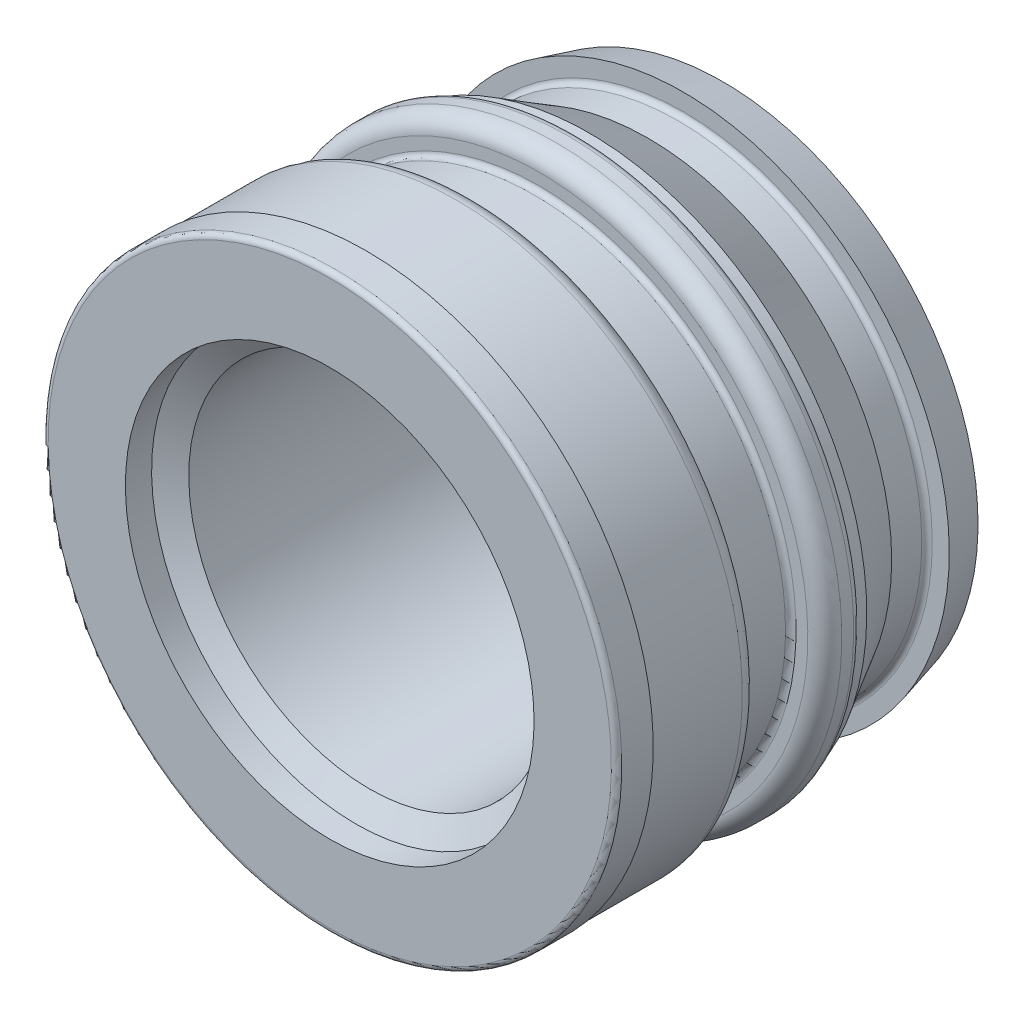
ISO-10303-21;
HEADER;
FILE_DESCRIPTION(('STEP AP214'),'2;1');
FILE_NAME('part.step','',(''),(''),'','','');
FILE_SCHEMA(('AUTOMOTIVE_DESIGN { 1 0 10303 214 1 1 1 1 }'));
ENDSEC;
DATA;
#1=APPLICATION_CONTEXT('core data for automotive mechanical design processes');
#2=APPLICATION_PROTOCOL_DEFINITION('international standard','automotive_design',2000,#1);
#3=PRODUCT_CONTEXT('',#1,'mechanical');
#4=PRODUCT('Part','Part','',(#3));
#5=PRODUCT_RELATED_PRODUCT_CATEGORY('part','',(#4));
#6=PRODUCT_DEFINITION_FORMATION('','',#4);
#7=PRODUCT_DEFINITION_CONTEXT('part definition',#1,'design');
#8=PRODUCT_DEFINITION('design','',#6,#7);
#9=PRODUCT_DEFINITION_SHAPE('','',#8);
#10=(LENGTH_UNIT() NAMED_UNIT(*) SI_UNIT(.MILLI.,.METRE.));
#11=(NAMED_UNIT(*) PLANE_ANGLE_UNIT() SI_UNIT($,.RADIAN.));
#12=(NAMED_UNIT(*) SI_UNIT($,.STERADIAN.) SOLID_ANGLE_UNIT());
#13=UNCERTAINTY_MEASURE_WITH_UNIT(LENGTH_MEASURE(1.E-05),#10,'distance_accuracy_value','');
#14=(GEOMETRIC_REPRESENTATION_CONTEXT(3) GLOBAL_UNCERTAINTY_ASSIGNED_CONTEXT((#13)) GLOBAL_UNIT_ASSIGNED_CONTEXT((#10,
#11,#12)) REPRESENTATION_CONTEXT('',''));
#15=CARTESIAN_POINT('',(0.,0.,0.));
#16=DIRECTION('',(0.,0.,1.));
#17=DIRECTION('',(1.,0.,0.));
#18=AXIS2_PLACEMENT_3D('',#15,#16,#17);
#19=CARTESIAN_POINT('',(0.,2.413,-1.524));
#20=DIRECTION('',(0.,0.,-1.));
#21=DIRECTION('',(0.,1.,0.));
#22=AXIS2_PLACEMENT_3D('',#19,#20,#21);
#23=PLANE('',#22);
#24=CARTESIAN_POINT('',(0.,0.,-1.524));
#25=DIRECTION('',(0.,0.,1.));
#26=DIRECTION('',(0.,-1.,0.));
#27=AXIS2_PLACEMENT_3D('',#24,#25,#26);
#28=CIRCLE('',#27,2.413);
#29=CARTESIAN_POINT('',(0.,-2.413,-1.524));
#30=VERTEX_POINT('',#29);
#31=EDGE_CURVE('E10',#30,#30,#28,.T.);
#32=ORIENTED_EDGE('',*,*,#31,.F.);
#33=EDGE_LOOP('',(#32));
#34=FACE_BOUND('',#33,.T.);
#35=CARTESIAN_POINT('',(0.,0.,-1.524));
#36=DIRECTION('',(0.,0.,1.));
#37=DIRECTION('',(0.,-1.,0.));
#38=AXIS2_PLACEMENT_3D('',#35,#36,#37);
#39=CIRCLE('',#38,2.5781);
#40=CARTESIAN_POINT('',(0.,-2.5781,-1.524));
#41=VERTEX_POINT('',#40);
#42=EDGE_CURVE('E142',#41,#41,#39,.T.);
#43=ORIENTED_EDGE('',*,*,#42,.T.);
#44=EDGE_LOOP('',(#43));
#45=FACE_BOUND('',#44,.T.);
#46=ADVANCED_FACE('F39',(#34,#45),#23,.F.);
#47=CARTESIAN_POINT('',(0.,0.,-1.4732));
#48=DIRECTION('',(0.,0.,1.));
#49=DIRECTION('',(0.,-1.,0.));
#50=AXIS2_PLACEMENT_3D('',#47,#48,#49);
#51=TOROIDAL_SURFACE('',#50,2.413,0.0508);
#52=CARTESIAN_POINT('',(0.,0.,-1.4732));
#53=DIRECTION('',(0.,0.,1.));
#54=DIRECTION('',(0.,-1.,0.));
#55=AXIS2_PLACEMENT_3D('',#52,#53,#54);
#56=CIRCLE('',#55,2.3622);
#57=CARTESIAN_POINT('',(0.,-2.3622,-1.4732));
#58=VERTEX_POINT('',#57);
#59=EDGE_CURVE('E46',#58,#58,#56,.T.);
#60=ORIENTED_EDGE('',*,*,#59,.F.);
#61=EDGE_LOOP('',(#60));
#62=FACE_BOUND('',#61,.T.);
#63=ORIENTED_EDGE('',*,*,#31,.T.);
#64=EDGE_LOOP('',(#63));
#65=FACE_BOUND('',#64,.T.);
#66=ADVANCED_FACE('F282',(#62,#65),#51,.F.);
#67=CARTESIAN_POINT('',(0.,0.,1.905));
#68=DIRECTION('',(0.,0.,1.));
#69=DIRECTION('',(0.,-1.,0.));
#70=AXIS2_PLACEMENT_3D('',#67,#68,#69);
#71=CYLINDRICAL_SURFACE('',#70,2.3622);
#72=CARTESIAN_POINT('',(0.,0.,-1.18152317665925));
#73=DIRECTION('',(0.,0.,1.));
#74=DIRECTION('',(0.,-1.,0.));
#75=AXIS2_PLACEMENT_3D('',#72,#73,#74);
#76=CIRCLE('',#75,2.3622);
#77=CARTESIAN_POINT('',(0.,-2.3622,-1.18152317665926));
#78=VERTEX_POINT('',#77);
#79=EDGE_CURVE('E51',#78,#78,#76,.T.);
#80=ORIENTED_EDGE('',*,*,#79,.F.);
#81=EDGE_LOOP('',(#80));
#82=FACE_BOUND('',#81,.T.);
#83=ORIENTED_EDGE('',*,*,#59,.T.);
#84=EDGE_LOOP('',(#83));
#85=FACE_BOUND('',#84,.T.);
#86=ADVANCED_FACE('F277',(#82,#85),#71,.T.);
#87=CARTESIAN_POINT('',(0.,0.,-1.18152317665925));
#88=DIRECTION('',(0.,0.,1.));
#89=DIRECTION('',(0.,-1.,0.));
#90=AXIS2_PLACEMENT_3D('',#87,#88,#89);
#91=CONICAL_SURFACE('',#90,2.3622,0.523598775598293);
#92=CARTESIAN_POINT('',(0.,0.,-0.609600000000003));
#93=DIRECTION('',(0.,0.,1.));
#94=DIRECTION('',(0.,-1.,0.));
#95=AXIS2_PLACEMENT_3D('',#92,#93,#94);
#96=CIRCLE('',#95,2.6924);
#97=CARTESIAN_POINT('',(0.,-2.6924,-0.609600000000004));
#98=VERTEX_POINT('',#97);
#99=EDGE_CURVE('E56',#98,#98,#96,.T.);
#100=ORIENTED_EDGE('',*,*,#99,.F.);
#101=EDGE_LOOP('',(#100));
#102=FACE_BOUND('',#101,.T.);
#103=ORIENTED_EDGE('',*,*,#79,.T.);
#104=EDGE_LOOP('',(#103));
#105=FACE_BOUND('',#104,.T.);
#106=ADVANCED_FACE('F271',(#102,#105),#91,.T.);
#107=CARTESIAN_POINT('',(0.,0.,1.905));
#108=DIRECTION('',(0.,0.,1.));
#109=DIRECTION('',(0.,-1.,0.));
#110=AXIS2_PLACEMENT_3D('',#107,#108,#109);
#111=CYLINDRICAL_SURFACE('',#110,2.6924);
#112=CARTESIAN_POINT('',(0.,0.,-0.482600000000002));
#113=DIRECTION('',(0.,0.,1.));
#114=DIRECTION('',(0.,-1.,0.));
#115=AXIS2_PLACEMENT_3D('',#112,#113,#114);
#116=CIRCLE('',#115,2.6924);
#117=CARTESIAN_POINT('',(0.,-2.6924,-0.482600000000003));
#118=VERTEX_POINT('',#117);
#119=EDGE_CURVE('E62',#118,#118,#116,.T.);
#120=ORIENTED_EDGE('',*,*,#119,.F.);
#121=EDGE_LOOP('',(#120));
#122=FACE_BOUND('',#121,.T.);
#123=ORIENTED_EDGE('',*,*,#99,.T.);
#124=EDGE_LOOP('',(#123));
#125=FACE_BOUND('',#124,.T.);
#126=ADVANCED_FACE('F265',(#122,#125),#111,.T.);
#127=CARTESIAN_POINT('',(0.,0.,-0.406400000000003));
#128=DIRECTION('',(0.,0.,1.));
#129=DIRECTION('',(0.,-1.,0.));
#130=AXIS2_PLACEMENT_3D('',#127,#128,#129);
#131=TOROIDAL_SURFACE('',#130,2.6924,0.0761999999999994);
#132=CARTESIAN_POINT('',(0.,0.,-0.406400000000003));
#133=DIRECTION('',(0.,0.,1.));
#134=DIRECTION('',(0.,-1.,0.));
#135=AXIS2_PLACEMENT_3D('',#132,#133,#134);
#136=CIRCLE('',#135,2.7686);
#137=CARTESIAN_POINT('',(0.,-2.7686,-0.406400000000004));
#138=VERTEX_POINT('',#137);
#139=EDGE_CURVE('E66',#138,#138,#136,.T.);
#140=ORIENTED_EDGE('',*,*,#139,.F.);
#141=EDGE_LOOP('',(#140));
#142=FACE_BOUND('',#141,.T.);
#143=ORIENTED_EDGE('',*,*,#119,.T.);
#144=EDGE_LOOP('',(#143));
#145=FACE_BOUND('',#144,.T.);
#146=ADVANCED_FACE('F259',(#142,#145),#131,.T.);
#147=CARTESIAN_POINT('',(0.,0.,1.905));
#148=DIRECTION('',(0.,0.,1.));
#149=DIRECTION('',(0.,-1.,0.));
#150=AXIS2_PLACEMENT_3D('',#147,#148,#149);
#151=CYLINDRICAL_SURFACE('',#150,2.7686);
#152=CARTESIAN_POINT('',(0.,0.,-0.292100000000002));
#153=DIRECTION('',(0.,0.,1.));
#154=DIRECTION('',(0.,-1.,0.));
#155=AXIS2_PLACEMENT_3D('',#152,#153,#154);
#156=CIRCLE('',#155,2.7686);
#157=CARTESIAN_POINT('',(0.,-2.7686,-0.292100000000003));
#158=VERTEX_POINT('',#157);
#159=EDGE_CURVE('E70',#158,#158,#156,.T.);
#160=ORIENTED_EDGE('',*,*,#159,.F.);
#161=EDGE_LOOP('',(#160));
#162=FACE_BOUND('',#161,.T.);
#163=ORIENTED_EDGE('',*,*,#139,.T.);
#164=EDGE_LOOP('',(#163));
#165=FACE_BOUND('',#164,.T.);
#166=ADVANCED_FACE('F253',(#162,#165),#151,.T.);
#167=CARTESIAN_POINT('',(0.,0.,-0.292100000000002));
#168=DIRECTION('',(0.,0.,1.));
#169=DIRECTION('',(0.,-1.,0.));
#170=AXIS2_PLACEMENT_3D('',#167,#168,#169);
#171=TOROIDAL_SURFACE('',#170,2.6035,0.1651);
#172=CARTESIAN_POINT('',(0.,0.,-0.127000000000003));
#173=DIRECTION('',(0.,0.,1.));
#174=DIRECTION('',(0.,-1.,0.));
#175=AXIS2_PLACEMENT_3D('',#172,#173,#174);
#176=CIRCLE('',#175,2.6035);
#177=CARTESIAN_POINT('',(0.,-2.6035,-0.127000000000003));
#178=VERTEX_POINT('',#177);
#179=EDGE_CURVE('E74',#178,#178,#176,.T.);
#180=ORIENTED_EDGE('',*,*,#179,.F.);
#181=EDGE_LOOP('',(#180));
#182=FACE_BOUND('',#181,.T.);
#183=ORIENTED_EDGE('',*,*,#159,.T.);
#184=EDGE_LOOP('',(#183));
#185=FACE_BOUND('',#184,.T.);
#186=ADVANCED_FACE('F247',(#182,#185),#171,.T.);
#187=CARTESIAN_POINT('',(0.,2.4892,-0.127000000000002));
#188=DIRECTION('',(0.,0.,-1.));
#189=DIRECTION('',(0.,1.,0.));
#190=AXIS2_PLACEMENT_3D('',#187,#188,#189);
#191=PLANE('',#190);
#192=CARTESIAN_POINT('',(0.,0.,-0.127000000000003));
#193=DIRECTION('',(0.,0.,1.));
#194=DIRECTION('',(0.,-1.,0.));
#195=AXIS2_PLACEMENT_3D('',#192,#193,#194);
#196=CIRCLE('',#195,2.4892);
#197=CARTESIAN_POINT('',(0.,-2.4892,-0.127000000000003));
#198=VERTEX_POINT('',#197);
#199=EDGE_CURVE('E78',#198,#198,#196,.T.);
#200=ORIENTED_EDGE('',*,*,#199,.F.);
#201=EDGE_LOOP('',(#200));
#202=FACE_BOUND('',#201,.T.);
#203=ORIENTED_EDGE('',*,*,#179,.T.);
#204=EDGE_LOOP('',(#203));
#205=FACE_BOUND('',#204,.T.);
#206=ADVANCED_FACE('F241',(#202,#205),#191,.F.);
#207=CARTESIAN_POINT('',(0.,0.,-0.0762000000000025));
#208=DIRECTION('',(0.,0.,1.));
#209=DIRECTION('',(0.,-1.,0.));
#210=AXIS2_PLACEMENT_3D('',#207,#208,#209);
#211=TOROIDAL_SURFACE('',#210,2.4892,0.0508000000000001);
#212=CARTESIAN_POINT('',(0.,0.,-0.0762000000000024));
#213=DIRECTION('',(0.,0.,1.));
#214=DIRECTION('',(0.,-1.,0.));
#215=AXIS2_PLACEMENT_3D('',#212,#213,#214);
#216=CIRCLE('',#215,2.4384);
#217=CARTESIAN_POINT('',(0.,-2.4384,-0.0762000000000031));
#218=VERTEX_POINT('',#217);
#219=EDGE_CURVE('E82',#218,#218,#216,.T.);
#220=ORIENTED_EDGE('',*,*,#219,.F.);
#221=EDGE_LOOP('',(#220));
#222=FACE_BOUND('',#221,.T.);
#223=ORIENTED_EDGE('',*,*,#199,.T.);
#224=EDGE_LOOP('',(#223));
#225=FACE_BOUND('',#224,.T.);
#226=ADVANCED_FACE('F235',(#222,#225),#211,.F.);
#227=CARTESIAN_POINT('',(0.,0.,1.905));
#228=DIRECTION('',(0.,0.,1.));
#229=DIRECTION('',(0.,-1.,0.));
#230=AXIS2_PLACEMENT_3D('',#227,#228,#229);
#231=CYLINDRICAL_SURFACE('',#230,2.4384);
#232=CARTESIAN_POINT('',(0.,0.,0.457199999999998));
#233=DIRECTION('',(0.,0.,1.));
#234=DIRECTION('',(0.,-1.,0.));
#235=AXIS2_PLACEMENT_3D('',#232,#233,#234);
#236=CIRCLE('',#235,2.4384);
#237=CARTESIAN_POINT('',(0.,-2.4384,0.457199999999997));
#238=VERTEX_POINT('',#237);
#239=EDGE_CURVE('E86',#238,#238,#236,.T.);
#240=ORIENTED_EDGE('',*,*,#239,.F.);
#241=EDGE_LOOP('',(#240));
#242=FACE_BOUND('',#241,.T.);
#243=ORIENTED_EDGE('',*,*,#219,.T.);
#244=EDGE_LOOP('',(#243));
#245=FACE_BOUND('',#244,.T.);
#246=ADVANCED_FACE('F229',(#242,#245),#231,.T.);
#247=CARTESIAN_POINT('',(0.,0.,0.457199999999998));
#248=DIRECTION('',(0.,0.,1.));
#249=DIRECTION('',(0.,-1.,0.));
#250=AXIS2_PLACEMENT_3D('',#247,#248,#249);
#251=TOROIDAL_SURFACE('',#250,2.4892,0.0507999999999999);
#252=CARTESIAN_POINT('',(0.,0.,0.507999999999998));
#253=DIRECTION('',(0.,0.,1.));
#254=DIRECTION('',(0.,-1.,0.));
#255=AXIS2_PLACEMENT_3D('',#252,#253,#254);
#256=CIRCLE('',#255,2.4892);
#257=CARTESIAN_POINT('',(0.,-2.4892,0.507999999999997));
#258=VERTEX_POINT('',#257);
#259=EDGE_CURVE('E90',#258,#258,#256,.T.);
#260=ORIENTED_EDGE('',*,*,#259,.F.);
#261=EDGE_LOOP('',(#260));
#262=FACE_BOUND('',#261,.T.);
#263=ORIENTED_EDGE('',*,*,#239,.T.);
#264=EDGE_LOOP('',(#263));
#265=FACE_BOUND('',#264,.T.);
#266=ADVANCED_FACE('F223',(#262,#265),#251,.F.);
#267=CARTESIAN_POINT('',(0.,2.6035,0.507999999999998));
#268=DIRECTION('',(0.,0.,1.));
#269=DIRECTION('',(0.,-1.,0.));
#270=AXIS2_PLACEMENT_3D('',#267,#268,#269);
#271=PLANE('',#270);
#272=CARTESIAN_POINT('',(0.,0.,0.507999999999997));
#273=DIRECTION('',(0.,0.,1.));
#274=DIRECTION('',(0.,-1.,0.));
#275=AXIS2_PLACEMENT_3D('',#272,#273,#274);
#276=CIRCLE('',#275,2.6035);
#277=CARTESIAN_POINT('',(0.,-2.6035,0.507999999999996));
#278=VERTEX_POINT('',#277);
#279=EDGE_CURVE('E94',#278,#278,#276,.T.);
#280=ORIENTED_EDGE('',*,*,#279,.F.);
#281=EDGE_LOOP('',(#280));
#282=FACE_BOUND('',#281,.T.);
#283=ORIENTED_EDGE('',*,*,#259,.T.);
#284=EDGE_LOOP('',(#283));
#285=FACE_BOUND('',#284,.T.);
#286=ADVANCED_FACE('F217',(#282,#285),#271,.F.);
#287=CARTESIAN_POINT('',(0.,0.,0.673099999999997));
#288=DIRECTION('',(0.,0.,1.));
#289=DIRECTION('',(0.,-1.,0.));
#290=AXIS2_PLACEMENT_3D('',#287,#288,#289);
#291=TOROIDAL_SURFACE('',#290,2.6035,0.1651);
#292=CARTESIAN_POINT('',(0.,0.,0.673099999999997));
#293=DIRECTION('',(0.,0.,1.));
#294=DIRECTION('',(0.,-1.,0.));
#295=AXIS2_PLACEMENT_3D('',#292,#293,#294);
#296=CIRCLE('',#295,2.7686);
#297=CARTESIAN_POINT('',(0.,-2.7686,0.673099999999996));
#298=VERTEX_POINT('',#297);
#299=EDGE_CURVE('E98',#298,#298,#296,.T.);
#300=ORIENTED_EDGE('',*,*,#299,.F.);
#301=EDGE_LOOP('',(#300));
#302=FACE_BOUND('',#301,.T.);
#303=ORIENTED_EDGE('',*,*,#279,.T.);
#304=EDGE_LOOP('',(#303));
#305=FACE_BOUND('',#304,.T.);
#306=ADVANCED_FACE('F211',(#302,#305),#291,.T.);
#307=CARTESIAN_POINT('',(0.,0.,1.905));
#308=DIRECTION('',(0.,0.,1.));
#309=DIRECTION('',(0.,-1.,0.));
#310=AXIS2_PLACEMENT_3D('',#307,#308,#309);
#311=CYLINDRICAL_SURFACE('',#310,2.7686);
#312=CARTESIAN_POINT('',(0.,0.,1.5494));
#313=DIRECTION('',(0.,0.,1.));
#314=DIRECTION('',(0.,-1.,0.));
#315=AXIS2_PLACEMENT_3D('',#312,#313,#314);
#316=CIRCLE('',#315,2.7686);
#317=CARTESIAN_POINT('',(0.,-2.7686,1.5494));
#318=VERTEX_POINT('',#317);
#319=EDGE_CURVE('E102',#318,#318,#316,.T.);
#320=ORIENTED_EDGE('',*,*,#319,.F.);
#321=EDGE_LOOP('',(#320));
#322=FACE_BOUND('',#321,.T.);
#323=ORIENTED_EDGE('',*,*,#299,.T.);
#324=EDGE_LOOP('',(#323));
#325=FACE_BOUND('',#324,.T.);
#326=ADVANCED_FACE('F205',(#322,#325),#311,.T.);
#327=CARTESIAN_POINT('',(0.,2.7813,1.5494));
#328=DIRECTION('',(0.,0.,1.));
#329=DIRECTION('',(0.,-1.,0.));
#330=AXIS2_PLACEMENT_3D('',#327,#328,#329);
#331=PLANE('',#330);
#332=CARTESIAN_POINT('',(0.,0.,1.5494));
#333=DIRECTION('',(0.,0.,1.));
#334=DIRECTION('',(0.,-1.,0.));
#335=AXIS2_PLACEMENT_3D('',#332,#333,#334);
#336=CIRCLE('',#335,2.7813);
#337=CARTESIAN_POINT('',(0.,-2.7813,1.5494));
#338=VERTEX_POINT('',#337);
#339=EDGE_CURVE('E106',#338,#338,#336,.T.);
#340=ORIENTED_EDGE('',*,*,#339,.F.);
#341=EDGE_LOOP('',(#340));
#342=FACE_BOUND('',#341,.T.);
#343=ORIENTED_EDGE('',*,*,#319,.T.);
#344=EDGE_LOOP('',(#343));
#345=FACE_BOUND('',#344,.T.);
#346=ADVANCED_FACE('F199',(#342,#345),#331,.F.);
#347=CARTESIAN_POINT('',(0.,0.,1.905));
#348=DIRECTION('',(0.,0.,1.));
#349=DIRECTION('',(0.,-1.,0.));
#350=AXIS2_PLACEMENT_3D('',#347,#348,#349);
#351=CYLINDRICAL_SURFACE('',#350,2.7813);
#352=CARTESIAN_POINT('',(0.,0.,1.8542));
#353=DIRECTION('',(0.,0.,1.));
#354=DIRECTION('',(0.,-1.,0.));
#355=AXIS2_PLACEMENT_3D('',#352,#353,#354);
#356=CIRCLE('',#355,2.7813);
#357=CARTESIAN_POINT('',(0.,-2.7813,1.8542));
#358=VERTEX_POINT('',#357);
#359=EDGE_CURVE('E110',#358,#358,#356,.T.);
#360=ORIENTED_EDGE('',*,*,#359,.F.);
#361=EDGE_LOOP('',(#360));
#362=FACE_BOUND('',#361,.T.);
#363=ORIENTED_EDGE('',*,*,#339,.T.);
#364=EDGE_LOOP('',(#363));
#365=FACE_BOUND('',#364,.T.);
#366=ADVANCED_FACE('F193',(#362,#365),#351,.T.);
#367=CARTESIAN_POINT('',(0.,0.,1.8542));
#368=DIRECTION('',(0.,0.,1.));
#369=DIRECTION('',(0.,-1.,0.));
#370=AXIS2_PLACEMENT_3D('',#367,#368,#369);
#371=TOROIDAL_SURFACE('',#370,2.7305,0.0508000000000004);
#372=CARTESIAN_POINT('',(0.,0.,1.905));
#373=DIRECTION('',(0.,0.,1.));
#374=DIRECTION('',(0.,-1.,0.));
#375=AXIS2_PLACEMENT_3D('',#372,#373,#374);
#376=CIRCLE('',#375,2.7305);
#377=CARTESIAN_POINT('',(0.,-2.7305,1.905));
#378=VERTEX_POINT('',#377);
#379=EDGE_CURVE('E114',#378,#378,#376,.T.);
#380=ORIENTED_EDGE('',*,*,#379,.F.);
#381=EDGE_LOOP('',(#380));
#382=FACE_BOUND('',#381,.T.);
#383=ORIENTED_EDGE('',*,*,#359,.T.);
#384=EDGE_LOOP('',(#383));
#385=FACE_BOUND('',#384,.T.);
#386=ADVANCED_FACE('F187',(#382,#385),#371,.T.);
#387=CARTESIAN_POINT('',(0.,2.7305,1.905));
#388=DIRECTION('',(0.,0.,-1.));
#389=DIRECTION('',(0.,1.,0.));
#390=AXIS2_PLACEMENT_3D('',#387,#388,#389);
#391=PLANE('',#390);
#392=CARTESIAN_POINT('',(0.,0.,1.905));
#393=DIRECTION('',(0.,0.,1.));
#394=DIRECTION('',(0.,-1.,0.));
#395=AXIS2_PLACEMENT_3D('',#392,#393,#394);
#396=CIRCLE('',#395,1.9812);
#397=CARTESIAN_POINT('',(0.,-1.9812,1.905));
#398=VERTEX_POINT('',#397);
#399=EDGE_CURVE('E118',#398,#398,#396,.T.);
#400=ORIENTED_EDGE('',*,*,#399,.F.);
#401=EDGE_LOOP('',(#400));
#402=FACE_BOUND('',#401,.T.);
#403=ORIENTED_EDGE('',*,*,#379,.T.);
#404=EDGE_LOOP('',(#403));
#405=FACE_BOUND('',#404,.T.);
#406=ADVANCED_FACE('F181',(#402,#405),#391,.F.);
#407=CARTESIAN_POINT('',(0.,0.,1.905));
#408=DIRECTION('',(0.,0.,1.));
#409=DIRECTION('',(0.,-1.,0.));
#410=AXIS2_PLACEMENT_3D('',#407,#408,#409);
#411=CYLINDRICAL_SURFACE('',#410,1.9812);
#412=CARTESIAN_POINT('',(0.,0.,1.651));
#413=DIRECTION('',(0.,0.,1.));
#414=DIRECTION('',(0.,-1.,0.));
#415=AXIS2_PLACEMENT_3D('',#412,#413,#414);
#416=CIRCLE('',#415,1.9812);
#417=CARTESIAN_POINT('',(0.,-1.9812,1.651));
#418=VERTEX_POINT('',#417);
#419=EDGE_CURVE('E122',#418,#418,#416,.T.);
#420=ORIENTED_EDGE('',*,*,#419,.F.);
#421=EDGE_LOOP('',(#420));
#422=FACE_BOUND('',#421,.T.);
#423=ORIENTED_EDGE('',*,*,#399,.T.);
#424=EDGE_LOOP('',(#423));
#425=FACE_BOUND('',#424,.T.);
#426=ADVANCED_FACE('F175',(#422,#425),#411,.F.);
#427=CARTESIAN_POINT('',(0.,0.,1.651));
#428=DIRECTION('',(0.,0.,1.));
#429=DIRECTION('',(0.,-1.,0.));
#430=AXIS2_PLACEMENT_3D('',#427,#428,#429);
#431=CONICAL_SURFACE('',#430,1.9812,1.0471975511966);
#432=CARTESIAN_POINT('',(0.,0.,1.51901772846325));
#433=DIRECTION('',(0.,0.,1.));
#434=DIRECTION('',(0.,-1.,0.));
#435=AXIS2_PLACEMENT_3D('',#432,#433,#434);
#436=CIRCLE('',#435,1.7526);
#437=CARTESIAN_POINT('',(0.,-1.7526,1.51901772846325));
#438=VERTEX_POINT('',#437);
#439=EDGE_CURVE('E126',#438,#438,#436,.T.);
#440=ORIENTED_EDGE('',*,*,#439,.F.);
#441=EDGE_LOOP('',(#440));
#442=FACE_BOUND('',#441,.T.);
#443=ORIENTED_EDGE('',*,*,#419,.T.);
#444=EDGE_LOOP('',(#443));
#445=FACE_BOUND('',#444,.T.);
#446=ADVANCED_FACE('F169',(#442,#445),#431,.F.);
#447=CARTESIAN_POINT('',(0.,0.,1.905));
#448=DIRECTION('',(0.,0.,1.));
#449=DIRECTION('',(0.,-1.,0.));
#450=AXIS2_PLACEMENT_3D('',#447,#448,#449);
#451=CYLINDRICAL_SURFACE('',#450,1.7526);
#452=CARTESIAN_POINT('',(0.,0.,-1.67639999999999));
#453=DIRECTION('',(0.,0.,1.));
#454=DIRECTION('',(0.,-1.,0.));
#455=AXIS2_PLACEMENT_3D('',#452,#453,#454);
#456=CIRCLE('',#455,1.7526);
#457=CARTESIAN_POINT('',(0.,-1.7526,-1.67639999999999));
#458=VERTEX_POINT('',#457);
#459=EDGE_CURVE('E130',#458,#458,#456,.T.);
#460=ORIENTED_EDGE('',*,*,#459,.F.);
#461=EDGE_LOOP('',(#460));
#462=FACE_BOUND('',#461,.T.);
#463=ORIENTED_EDGE('',*,*,#439,.T.);
#464=EDGE_LOOP('',(#463));
#465=FACE_BOUND('',#464,.T.);
#466=ADVANCED_FACE('F163',(#462,#465),#451,.F.);
#467=CARTESIAN_POINT('',(0.,0.,-1.67639999999999));
#468=DIRECTION('',(0.,0.,-1.));
#469=DIRECTION('',(0.,1.,0.));
#470=AXIS2_PLACEMENT_3D('',#467,#468,#469);
#471=CONICAL_SURFACE('',#470,1.7526,0.785398163397448);
#472=CARTESIAN_POINT('',(0.,0.,-1.905));
#473=DIRECTION('',(0.,0.,1.));
#474=DIRECTION('',(0.,-1.,0.));
#475=AXIS2_PLACEMENT_3D('',#472,#473,#474);
#476=CIRCLE('',#475,1.98120000000001);
#477=CARTESIAN_POINT('',(0.,-1.98120000000001,-1.905));
#478=VERTEX_POINT('',#477);
#479=EDGE_CURVE('E134',#478,#478,#476,.T.);
#480=ORIENTED_EDGE('',*,*,#479,.F.);
#481=EDGE_LOOP('',(#480));
#482=FACE_BOUND('',#481,.T.);
#483=ORIENTED_EDGE('',*,*,#459,.T.);
#484=EDGE_LOOP('',(#483));
#485=FACE_BOUND('',#484,.T.);
#486=ADVANCED_FACE('F157',(#482,#485),#471,.F.);
#487=CARTESIAN_POINT('',(0.,1.98120000000001,-1.905));
#488=DIRECTION('',(0.,0.,1.));
#489=DIRECTION('',(0.,-1.,0.));
#490=AXIS2_PLACEMENT_3D('',#487,#488,#489);
#491=PLANE('',#490);
#492=CARTESIAN_POINT('',(0.,0.,-1.905));
#493=DIRECTION('',(0.,0.,1.));
#494=DIRECTION('',(0.,-1.,0.));
#495=AXIS2_PLACEMENT_3D('',#492,#493,#494);
#496=CIRCLE('',#495,2.47601135768374);
#497=CARTESIAN_POINT('',(0.,-2.47601135768374,-1.905));
#498=VERTEX_POINT('',#497);
#499=EDGE_CURVE('E138',#498,#498,#496,.T.);
#500=ORIENTED_EDGE('',*,*,#499,.F.);
#501=EDGE_LOOP('',(#500));
#502=FACE_BOUND('',#501,.T.);
#503=ORIENTED_EDGE('',*,*,#479,.T.);
#504=EDGE_LOOP('',(#503));
#505=FACE_BOUND('',#504,.T.);
#506=ADVANCED_FACE('F151',(#502,#505),#491,.F.);
#507=CARTESIAN_POINT('',(0.,0.,-1.905));
#508=DIRECTION('',(0.,0.,1.));
#509=DIRECTION('',(0.,-1.,0.));
#510=AXIS2_PLACEMENT_3D('',#507,#508,#509);
#511=CONICAL_SURFACE('',#510,2.47601135768374,0.261799387799143);
#512=ORIENTED_EDGE('',*,*,#42,.F.);
#513=EDGE_LOOP('',(#512));
#514=FACE_BOUND('',#513,.T.);
#515=ORIENTED_EDGE('',*,*,#499,.T.);
#516=EDGE_LOOP('',(#515));
#517=FACE_BOUND('',#516,.T.);
#518=ADVANCED_FACE('F148',(#514,#517),#511,.T.);
#519=CLOSED_SHELL('',(#46,#66,#86,#106,#126,#146,#166,#186,#206,#226,#246,#266,#286,#306,#326,
#346,#366,#386,#406,#426,#446,#466,#486,#506,#518));
#520=MANIFOLD_SOLID_BREP('B2',#519);
#521=ADVANCED_BREP_SHAPE_REPRESENTATION('',(#18,#520),#14);
#522=SHAPE_DEFINITION_REPRESENTATION(#9,#521);
ENDSEC;
END-ISO-10303-21;
